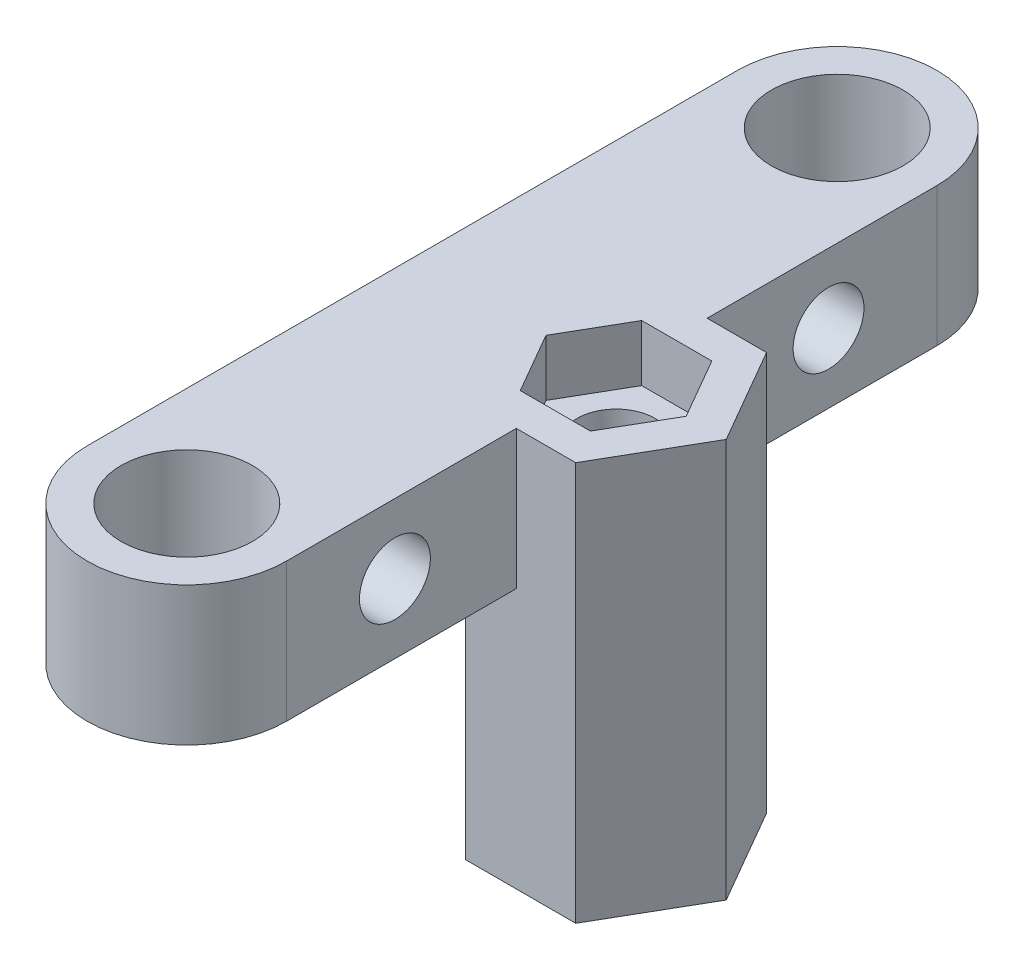
ISO-10303-21;
HEADER;
FILE_DESCRIPTION(('STEP AP214'),'2;1');
FILE_NAME('part.step','',(''),(''),'','','');
FILE_SCHEMA(('AUTOMOTIVE_DESIGN { 1 0 10303 214 1 1 1 1 }'));
ENDSEC;
DATA;
#1=APPLICATION_CONTEXT('core data for automotive mechanical design processes');
#2=APPLICATION_PROTOCOL_DEFINITION('international standard','automotive_design',2000,#1);
#3=PRODUCT_CONTEXT('',#1,'mechanical');
#4=PRODUCT('Part','Part','',(#3));
#5=PRODUCT_RELATED_PRODUCT_CATEGORY('part','',(#4));
#6=PRODUCT_DEFINITION_FORMATION('','',#4);
#7=PRODUCT_DEFINITION_CONTEXT('part definition',#1,'design');
#8=PRODUCT_DEFINITION('design','',#6,#7);
#9=PRODUCT_DEFINITION_SHAPE('','',#8);
#10=(LENGTH_UNIT() NAMED_UNIT(*) SI_UNIT(.MILLI.,.METRE.));
#11=(NAMED_UNIT(*) PLANE_ANGLE_UNIT() SI_UNIT($,.RADIAN.));
#12=(NAMED_UNIT(*) SI_UNIT($,.STERADIAN.) SOLID_ANGLE_UNIT());
#13=UNCERTAINTY_MEASURE_WITH_UNIT(LENGTH_MEASURE(1.E-05),#10,'distance_accuracy_value','');
#14=(GEOMETRIC_REPRESENTATION_CONTEXT(3) GLOBAL_UNCERTAINTY_ASSIGNED_CONTEXT((#13)) GLOBAL_UNIT_ASSIGNED_CONTEXT((#10,
#11,#12)) REPRESENTATION_CONTEXT('',''));
#15=CARTESIAN_POINT('',(0.,0.,0.));
#16=DIRECTION('',(0.,0.,1.));
#17=DIRECTION('',(1.,0.,0.));
#18=AXIS2_PLACEMENT_3D('',#15,#16,#17);
#19=CARTESIAN_POINT('',(0.,0.,0.));
#20=DIRECTION('',(0.,1.,0.));
#21=DIRECTION('',(0.,0.,1.));
#22=AXIS2_PLACEMENT_3D('',#19,#20,#21);
#23=PLANE('',#22);
#24=CARTESIAN_POINT('',(-12.,0.,-37.5));
#25=DIRECTION('',(0.,1.,0.));
#26=DIRECTION('',(0.,0.,1.));
#27=AXIS2_PLACEMENT_3D('',#24,#25,#26);
#28=CIRCLE('',#27,7.5875);
#29=CARTESIAN_POINT('',(-12.,0.,-29.9125));
#30=VERTEX_POINT('',#29);
#31=EDGE_CURVE('E354',#30,#30,#28,.T.);
#32=ORIENTED_EDGE('',*,*,#31,.T.);
#33=EDGE_LOOP('',(#32));
#34=FACE_BOUND('',#33,.T.);
#35=CARTESIAN_POINT('',(-12.,0.,37.5));
#36=DIRECTION('',(0.,1.,0.));
#37=DIRECTION('',(0.,0.,1.));
#38=AXIS2_PLACEMENT_3D('',#35,#36,#37);
#39=CIRCLE('',#38,7.5875);
#40=CARTESIAN_POINT('',(-12.,0.,45.0875));
#41=VERTEX_POINT('',#40);
#42=EDGE_CURVE('E311',#41,#41,#39,.F.);
#43=ORIENTED_EDGE('',*,*,#42,.F.);
#44=EDGE_LOOP('',(#43));
#45=FACE_BOUND('',#44,.T.);
#46=DIRECTION('',(1.,0.,0.));
#47=VECTOR('',#46,1.);
#48=CARTESIAN_POINT('',(-6.35085296108588,0.,-11.));
#49=LINE('',#48,#47);
#50=CARTESIAN_POINT('',(-6.35085296108588,0.,-11.));
#51=VERTEX_POINT('',#50);
#52=CARTESIAN_POINT('',(-0.500000000000007,0.,-11.));
#53=VERTEX_POINT('',#52);
#54=EDGE_CURVE('E51',#51,#53,#49,.T.);
#55=ORIENTED_EDGE('',*,*,#54,.F.);
#56=DIRECTION('',(0.5,0.,-0.866025403784439));
#57=VECTOR('',#56,1.);
#58=CARTESIAN_POINT('',(-12.7017059221718,0.,0.));
#59=LINE('',#58,#57);
#60=CARTESIAN_POINT('',(-12.7017059221718,0.,0.));
#61=VERTEX_POINT('',#60);
#62=EDGE_CURVE('E55',#61,#51,#59,.T.);
#63=ORIENTED_EDGE('',*,*,#62,.F.);
#64=DIRECTION('',(-0.5,0.,-0.866025403784439));
#65=VECTOR('',#64,1.);
#66=CARTESIAN_POINT('',(-6.35085296108588,0.,11.));
#67=LINE('',#66,#65);
#68=CARTESIAN_POINT('',(-6.35085296108588,0.,11.));
#69=VERTEX_POINT('',#68);
#70=EDGE_CURVE('E215',#69,#61,#67,.T.);
#71=ORIENTED_EDGE('',*,*,#70,.F.);
#72=DIRECTION('',(-1.,0.,0.));
#73=VECTOR('',#72,1.);
#74=CARTESIAN_POINT('',(6.35085296108587,0.,11.));
#75=LINE('',#74,#73);
#76=CARTESIAN_POINT('',(-0.500000000000007,0.,11.));
#77=VERTEX_POINT('',#76);
#78=EDGE_CURVE('E11',#77,#69,#75,.T.);
#79=ORIENTED_EDGE('',*,*,#78,.F.);
#80=DIRECTION('',(0.,0.,-1.));
#81=VECTOR('',#80,1.);
#82=CARTESIAN_POINT('',(-0.500000000000006,0.,0.));
#83=LINE('',#82,#81);
#84=CARTESIAN_POINT('',(-0.500000000000011,0.,37.5));
#85=VERTEX_POINT('',#84);
#86=EDGE_CURVE('E299',#85,#77,#83,.T.);
#87=ORIENTED_EDGE('',*,*,#86,.F.);
#88=CARTESIAN_POINT('',(-12.,0.,37.5));
#89=DIRECTION('',(0.,1.,0.));
#90=DIRECTION('',(0.,0.,1.));
#91=AXIS2_PLACEMENT_3D('',#88,#89,#90);
#92=CIRCLE('',#91,11.5);
#93=CARTESIAN_POINT('',(-23.5,0.,37.5));
#94=VERTEX_POINT('',#93);
#95=EDGE_CURVE('E303',#94,#85,#92,.T.);
#96=ORIENTED_EDGE('',*,*,#95,.F.);
#97=DIRECTION('',(0.,0.,-1.));
#98=VECTOR('',#97,1.);
#99=CARTESIAN_POINT('',(-23.5,0.,0.));
#100=LINE('',#99,#98);
#101=CARTESIAN_POINT('',(-23.5,0.,-37.5));
#102=VERTEX_POINT('',#101);
#103=EDGE_CURVE('E414',#94,#102,#100,.T.);
#104=ORIENTED_EDGE('',*,*,#103,.T.);
#105=CARTESIAN_POINT('',(-12.,0.,-37.5));
#106=DIRECTION('',(0.,1.,0.));
#107=DIRECTION('',(0.,0.,1.));
#108=AXIS2_PLACEMENT_3D('',#105,#106,#107);
#109=CIRCLE('',#108,11.5);
#110=CARTESIAN_POINT('',(-0.500000000000011,0.,-37.5));
#111=VERTEX_POINT('',#110);
#112=EDGE_CURVE('E359',#102,#111,#109,.F.);
#113=ORIENTED_EDGE('',*,*,#112,.T.);
#114=DIRECTION('',(0.,0.,1.));
#115=VECTOR('',#114,1.);
#116=CARTESIAN_POINT('',(-0.500000000000006,0.,0.));
#117=LINE('',#116,#115);
#118=EDGE_CURVE('E302',#111,#53,#117,.T.);
#119=ORIENTED_EDGE('',*,*,#118,.T.);
#120=EDGE_LOOP('',(#55,#63,#71,#79,#87,#96,#104,#113,#119));
#121=FACE_BOUND('',#120,.T.);
#122=ADVANCED_FACE('F34',(#34,#45,#121),#23,.F.);
#123=CARTESIAN_POINT('',(6.06217782649107,16.,3.5));
#124=DIRECTION('',(-0.866025403784439,0.,-0.5));
#125=DIRECTION('',(-0.5,0.,0.866025403784439));
#126=AXIS2_PLACEMENT_3D('',#123,#124,#125);
#127=PLANE('',#126);
#128=DIRECTION('',(0.5,0.,-0.866025403784439));
#129=VECTOR('',#128,1.);
#130=CARTESIAN_POINT('',(6.06217782649107,9.5,3.5));
#131=LINE('',#130,#129);
#132=CARTESIAN_POINT('',(4.04145188432738,9.5,7.));
#133=VERTEX_POINT('',#132);
#134=CARTESIAN_POINT('',(8.08290376865475,9.5,0.));
#135=VERTEX_POINT('',#134);
#136=EDGE_CURVE('E519',#133,#135,#131,.T.);
#137=ORIENTED_EDGE('',*,*,#136,.F.);
#138=DIRECTION('',(0.,-1.,0.));
#139=VECTOR('',#138,1.);
#140=CARTESIAN_POINT('',(4.04145188432738,16.,7.));
#141=LINE('',#140,#139);
#142=CARTESIAN_POINT('',(4.04145188432738,16.,7.));
#143=VERTEX_POINT('',#142);
#144=EDGE_CURVE('E43',#143,#133,#141,.T.);
#145=ORIENTED_EDGE('',*,*,#144,.F.);
#146=DIRECTION('',(0.5,0.,-0.866025403784439));
#147=VECTOR('',#146,1.);
#148=CARTESIAN_POINT('',(6.06217782649107,16.,3.5));
#149=LINE('',#148,#147);
#150=CARTESIAN_POINT('',(8.08290376865475,16.,0.));
#151=VERTEX_POINT('',#150);
#152=EDGE_CURVE('E394',#143,#151,#149,.T.);
#153=ORIENTED_EDGE('',*,*,#152,.T.);
#154=DIRECTION('',(0.,-1.,0.));
#155=VECTOR('',#154,1.);
#156=CARTESIAN_POINT('',(8.08290376865475,16.,0.));
#157=LINE('',#156,#155);
#158=EDGE_CURVE('E325',#151,#135,#157,.T.);
#159=ORIENTED_EDGE('',*,*,#158,.T.);
#160=EDGE_LOOP('',(#137,#145,#153,#159));
#161=FACE_BOUND('',#160,.T.);
#162=ADVANCED_FACE('F475',(#161),#127,.T.);
#163=CARTESIAN_POINT('',(0.,16.,7.));
#164=DIRECTION('',(0.,0.,-1.));
#165=DIRECTION('',(-1.,0.,0.));
#166=AXIS2_PLACEMENT_3D('',#163,#164,#165);
#167=PLANE('',#166);
#168=DIRECTION('',(1.,0.,0.));
#169=VECTOR('',#168,1.);
#170=CARTESIAN_POINT('',(0.,9.5,7.));
#171=LINE('',#170,#169);
#172=CARTESIAN_POINT('',(-4.04145188432738,9.5,7.));
#173=VERTEX_POINT('',#172);
#174=EDGE_CURVE('E505',#173,#133,#171,.T.);
#175=ORIENTED_EDGE('',*,*,#174,.F.);
#176=DIRECTION('',(0.,-1.,0.));
#177=VECTOR('',#176,1.);
#178=CARTESIAN_POINT('',(-4.04145188432738,16.,7.));
#179=LINE('',#178,#177);
#180=CARTESIAN_POINT('',(-4.04145188432738,16.,7.));
#181=VERTEX_POINT('',#180);
#182=EDGE_CURVE('E337',#181,#173,#179,.T.);
#183=ORIENTED_EDGE('',*,*,#182,.F.);
#184=DIRECTION('',(1.,0.,0.));
#185=VECTOR('',#184,1.);
#186=CARTESIAN_POINT('',(0.,16.,7.));
#187=LINE('',#186,#185);
#188=EDGE_CURVE('E397',#181,#143,#187,.T.);
#189=ORIENTED_EDGE('',*,*,#188,.T.);
#190=ORIENTED_EDGE('',*,*,#144,.T.);
#191=EDGE_LOOP('',(#175,#183,#189,#190));
#192=FACE_BOUND('',#191,.T.);
#193=ADVANCED_FACE('F482',(#192),#167,.T.);
#194=CARTESIAN_POINT('',(-6.06217782649107,16.,3.5));
#195=DIRECTION('',(0.866025403784439,0.,-0.5));
#196=DIRECTION('',(-0.5,0.,-0.866025403784439));
#197=AXIS2_PLACEMENT_3D('',#194,#195,#196);
#198=PLANE('',#197);
#199=DIRECTION('',(0.5,0.,0.866025403784439));
#200=VECTOR('',#199,1.);
#201=CARTESIAN_POINT('',(-6.06217782649107,9.5,3.5));
#202=LINE('',#201,#200);
#203=CARTESIAN_POINT('',(-8.08290376865476,9.5,0.));
#204=VERTEX_POINT('',#203);
#205=EDGE_CURVE('E507',#204,#173,#202,.T.);
#206=ORIENTED_EDGE('',*,*,#205,.F.);
#207=DIRECTION('',(0.,-1.,0.));
#208=VECTOR('',#207,1.);
#209=CARTESIAN_POINT('',(-8.08290376865476,16.,0.));
#210=LINE('',#209,#208);
#211=CARTESIAN_POINT('',(-8.08290376865476,16.,0.));
#212=VERTEX_POINT('',#211);
#213=EDGE_CURVE('E334',#212,#204,#210,.T.);
#214=ORIENTED_EDGE('',*,*,#213,.F.);
#215=DIRECTION('',(0.5,0.,0.866025403784439));
#216=VECTOR('',#215,1.);
#217=CARTESIAN_POINT('',(-6.06217782649107,16.,3.5));
#218=LINE('',#217,#216);
#219=EDGE_CURVE('E400',#212,#181,#218,.T.);
#220=ORIENTED_EDGE('',*,*,#219,.T.);
#221=ORIENTED_EDGE('',*,*,#182,.T.);
#222=EDGE_LOOP('',(#206,#214,#220,#221));
#223=FACE_BOUND('',#222,.T.);
#224=ADVANCED_FACE('F527',(#223),#198,.T.);
#225=CARTESIAN_POINT('',(-6.06217782649107,16.,-3.5));
#226=DIRECTION('',(0.866025403784439,0.,0.5));
#227=DIRECTION('',(0.5,0.,-0.866025403784439));
#228=AXIS2_PLACEMENT_3D('',#225,#226,#227);
#229=PLANE('',#228);
#230=DIRECTION('',(-0.5,0.,0.866025403784439));
#231=VECTOR('',#230,1.);
#232=CARTESIAN_POINT('',(-6.06217782649107,9.5,-3.5));
#233=LINE('',#232,#231);
#234=CARTESIAN_POINT('',(-4.04145188432738,9.5,-7.));
#235=VERTEX_POINT('',#234);
#236=EDGE_CURVE('E510',#235,#204,#233,.T.);
#237=ORIENTED_EDGE('',*,*,#236,.F.);
#238=DIRECTION('',(0.,-1.,0.));
#239=VECTOR('',#238,1.);
#240=CARTESIAN_POINT('',(-4.04145188432738,16.,-7.));
#241=LINE('',#240,#239);
#242=CARTESIAN_POINT('',(-4.04145188432738,16.,-7.));
#243=VERTEX_POINT('',#242);
#244=EDGE_CURVE('E331',#243,#235,#241,.T.);
#245=ORIENTED_EDGE('',*,*,#244,.F.);
#246=DIRECTION('',(-0.5,0.,0.866025403784439));
#247=VECTOR('',#246,1.);
#248=CARTESIAN_POINT('',(-6.06217782649107,16.,-3.5));
#249=LINE('',#248,#247);
#250=EDGE_CURVE('E403',#243,#212,#249,.T.);
#251=ORIENTED_EDGE('',*,*,#250,.T.);
#252=ORIENTED_EDGE('',*,*,#213,.T.);
#253=EDGE_LOOP('',(#237,#245,#251,#252));
#254=FACE_BOUND('',#253,.T.);
#255=ADVANCED_FACE('F534',(#254),#229,.T.);
#256=CARTESIAN_POINT('',(0.,16.,-7.));
#257=DIRECTION('',(0.,0.,1.));
#258=DIRECTION('',(1.,0.,0.));
#259=AXIS2_PLACEMENT_3D('',#256,#257,#258);
#260=PLANE('',#259);
#261=DIRECTION('',(-1.,0.,0.));
#262=VECTOR('',#261,1.);
#263=CARTESIAN_POINT('',(0.,9.5,-7.));
#264=LINE('',#263,#262);
#265=CARTESIAN_POINT('',(4.04145188432737,9.5,-7.));
#266=VERTEX_POINT('',#265);
#267=EDGE_CURVE('E513',#266,#235,#264,.T.);
#268=ORIENTED_EDGE('',*,*,#267,.F.);
#269=DIRECTION('',(0.,-1.,0.));
#270=VECTOR('',#269,1.);
#271=CARTESIAN_POINT('',(4.04145188432737,16.,-7.));
#272=LINE('',#271,#270);
#273=CARTESIAN_POINT('',(4.04145188432737,16.,-7.));
#274=VERTEX_POINT('',#273);
#275=EDGE_CURVE('E328',#274,#266,#272,.T.);
#276=ORIENTED_EDGE('',*,*,#275,.F.);
#277=DIRECTION('',(-1.,0.,0.));
#278=VECTOR('',#277,1.);
#279=CARTESIAN_POINT('',(0.,16.,-7.));
#280=LINE('',#279,#278);
#281=EDGE_CURVE('E406',#274,#243,#280,.T.);
#282=ORIENTED_EDGE('',*,*,#281,.T.);
#283=ORIENTED_EDGE('',*,*,#244,.T.);
#284=EDGE_LOOP('',(#268,#276,#282,#283));
#285=FACE_BOUND('',#284,.T.);
#286=ADVANCED_FACE('F537',(#285),#260,.T.);
#287=CARTESIAN_POINT('',(-12.,16.,-37.5));
#288=DIRECTION('',(0.,-1.,0.));
#289=DIRECTION('',(0.,0.,-1.));
#290=AXIS2_PLACEMENT_3D('',#287,#288,#289);
#291=CYLINDRICAL_SURFACE('',#290,11.5);
#292=ORIENTED_EDGE('',*,*,#112,.F.);
#293=DIRECTION('',(0.,-1.,0.));
#294=VECTOR('',#293,1.);
#295=CARTESIAN_POINT('',(-23.5,16.,-37.5));
#296=LINE('',#295,#294);
#297=CARTESIAN_POINT('',(-23.5,16.,-37.5));
#298=VERTEX_POINT('',#297);
#299=EDGE_CURVE('E329',#298,#102,#296,.T.);
#300=ORIENTED_EDGE('',*,*,#299,.F.);
#301=CARTESIAN_POINT('',(-12.,16.,-37.5));
#302=DIRECTION('',(0.,1.,0.));
#303=DIRECTION('',(0.,0.,1.));
#304=AXIS2_PLACEMENT_3D('',#301,#302,#303);
#305=CIRCLE('',#304,11.5);
#306=CARTESIAN_POINT('',(-0.500000000000011,16.,-37.5));
#307=VERTEX_POINT('',#306);
#308=EDGE_CURVE('E320',#298,#307,#305,.F.);
#309=ORIENTED_EDGE('',*,*,#308,.T.);
#310=DIRECTION('',(0.,-1.,0.));
#311=VECTOR('',#310,1.);
#312=CARTESIAN_POINT('',(-0.500000000000011,16.,-37.5));
#313=LINE('',#312,#311);
#314=EDGE_CURVE('E309',#307,#111,#313,.T.);
#315=ORIENTED_EDGE('',*,*,#314,.T.);
#316=EDGE_LOOP('',(#292,#300,#309,#315));
#317=FACE_BOUND('',#316,.T.);
#318=ADVANCED_FACE('F429',(#317),#291,.T.);
#319=CARTESIAN_POINT('',(-23.5,16.,0.));
#320=DIRECTION('',(-1.,0.,0.));
#321=DIRECTION('',(0.,0.,1.));
#322=AXIS2_PLACEMENT_3D('',#319,#320,#321);
#323=PLANE('',#322);
#324=CARTESIAN_POINT('',(-23.5,8.,25.));
#325=DIRECTION('',(-1.,0.,0.));
#326=DIRECTION('',(0.,0.,-1.));
#327=AXIS2_PLACEMENT_3D('',#324,#325,#326);
#328=CIRCLE('',#327,4.0875);
#329=CARTESIAN_POINT('',(-23.5,8.,20.9125));
#330=VERTEX_POINT('',#329);
#331=EDGE_CURVE('E366',#330,#330,#328,.T.);
#332=ORIENTED_EDGE('',*,*,#331,.F.);
#333=EDGE_LOOP('',(#332));
#334=FACE_BOUND('',#333,.T.);
#335=CARTESIAN_POINT('',(-23.5,8.,-25.));
#336=DIRECTION('',(-1.,0.,0.));
#337=DIRECTION('',(0.,0.,1.));
#338=AXIS2_PLACEMENT_3D('',#335,#336,#337);
#339=CIRCLE('',#338,4.0875);
#340=CARTESIAN_POINT('',(-23.5,8.,-20.9125));
#341=VERTEX_POINT('',#340);
#342=EDGE_CURVE('E355',#341,#341,#339,.T.);
#343=ORIENTED_EDGE('',*,*,#342,.F.);
#344=EDGE_LOOP('',(#343));
#345=FACE_BOUND('',#344,.T.);
#346=ORIENTED_EDGE('',*,*,#103,.F.);
#347=DIRECTION('',(0.,-1.,0.));
#348=VECTOR('',#347,1.);
#349=CARTESIAN_POINT('',(-23.5,16.,37.5));
#350=LINE('',#349,#348);
#351=CARTESIAN_POINT('',(-23.5,16.,37.5));
#352=VERTEX_POINT('',#351);
#353=EDGE_CURVE('E350',#352,#94,#350,.T.);
#354=ORIENTED_EDGE('',*,*,#353,.F.);
#355=DIRECTION('',(0.,0.,-1.));
#356=VECTOR('',#355,1.);
#357=CARTESIAN_POINT('',(-23.5,16.,0.));
#358=LINE('',#357,#356);
#359=EDGE_CURVE('E372',#352,#298,#358,.T.);
#360=ORIENTED_EDGE('',*,*,#359,.T.);
#361=ORIENTED_EDGE('',*,*,#299,.T.);
#362=EDGE_LOOP('',(#346,#354,#360,#361));
#363=FACE_BOUND('',#362,.T.);
#364=ADVANCED_FACE('F424',(#334,#345,#363),#323,.T.);
#365=CARTESIAN_POINT('',(-12.,16.,37.5));
#366=DIRECTION('',(0.,-1.,0.));
#367=DIRECTION('',(0.,0.,-1.));
#368=AXIS2_PLACEMENT_3D('',#365,#366,#367);
#369=CYLINDRICAL_SURFACE('',#368,11.5);
#370=ORIENTED_EDGE('',*,*,#95,.T.);
#371=DIRECTION('',(0.,-1.,0.));
#372=VECTOR('',#371,1.);
#373=CARTESIAN_POINT('',(-0.500000000000011,16.,37.5));
#374=LINE('',#373,#372);
#375=CARTESIAN_POINT('',(-0.500000000000011,16.,37.5));
#376=VERTEX_POINT('',#375);
#377=EDGE_CURVE('E295',#376,#85,#374,.T.);
#378=ORIENTED_EDGE('',*,*,#377,.F.);
#379=CARTESIAN_POINT('',(-12.,16.,37.5));
#380=DIRECTION('',(0.,1.,0.));
#381=DIRECTION('',(0.,0.,1.));
#382=AXIS2_PLACEMENT_3D('',#379,#380,#381);
#383=CIRCLE('',#382,11.5);
#384=EDGE_CURVE('E375',#352,#376,#383,.T.);
#385=ORIENTED_EDGE('',*,*,#384,.F.);
#386=ORIENTED_EDGE('',*,*,#353,.T.);
#387=EDGE_LOOP('',(#370,#378,#385,#386));
#388=FACE_BOUND('',#387,.T.);
#389=ADVANCED_FACE('F421',(#388),#369,.T.);
#390=CARTESIAN_POINT('',(-0.500000000000006,16.,0.));
#391=DIRECTION('',(-1.,0.,0.));
#392=DIRECTION('',(0.,0.,1.));
#393=AXIS2_PLACEMENT_3D('',#390,#391,#392);
#394=PLANE('',#393);
#395=CARTESIAN_POINT('',(-0.500000000000009,8.,25.));
#396=DIRECTION('',(-1.,0.,0.));
#397=DIRECTION('',(0.,0.,1.));
#398=AXIS2_PLACEMENT_3D('',#395,#396,#397);
#399=CIRCLE('',#398,4.0875);
#400=CARTESIAN_POINT('',(-0.50000000000001,8.,29.0875));
#401=VERTEX_POINT('',#400);
#402=EDGE_CURVE('E288',#401,#401,#399,.T.);
#403=ORIENTED_EDGE('',*,*,#402,.T.);
#404=EDGE_LOOP('',(#403));
#405=FACE_BOUND('',#404,.T.);
#406=ORIENTED_EDGE('',*,*,#86,.T.);
#407=DIRECTION('',(0.,-1.,0.));
#408=VECTOR('',#407,1.);
#409=CARTESIAN_POINT('',(-0.500000000000007,16.,11.));
#410=LINE('',#409,#408);
#411=CARTESIAN_POINT('',(-0.500000000000007,16.,11.));
#412=VERTEX_POINT('',#411);
#413=EDGE_CURVE('E292',#412,#77,#410,.T.);
#414=ORIENTED_EDGE('',*,*,#413,.F.);
#415=DIRECTION('',(0.,0.,-1.));
#416=VECTOR('',#415,1.);
#417=CARTESIAN_POINT('',(-0.500000000000006,16.,0.));
#418=LINE('',#417,#416);
#419=EDGE_CURVE('E378',#376,#412,#418,.T.);
#420=ORIENTED_EDGE('',*,*,#419,.F.);
#421=ORIENTED_EDGE('',*,*,#377,.T.);
#422=EDGE_LOOP('',(#406,#414,#420,#421));
#423=FACE_BOUND('',#422,.T.);
#424=ADVANCED_FACE('F452',(#405,#423),#394,.F.);
#425=CARTESIAN_POINT('',(0.,16.,11.));
#426=DIRECTION('',(0.,0.,1.));
#427=DIRECTION('',(1.,0.,0.));
#428=AXIS2_PLACEMENT_3D('',#425,#426,#427);
#429=PLANE('',#428);
#430=ORIENTED_EDGE('',*,*,#413,.T.);
#431=ORIENTED_EDGE('',*,*,#78,.T.);
#432=DIRECTION('',(0.,1.,0.));
#433=VECTOR('',#432,1.);
#434=CARTESIAN_POINT('',(-6.35085296108588,-30.,11.));
#435=LINE('',#434,#433);
#436=CARTESIAN_POINT('',(-6.35085296108588,-30.,11.));
#437=VERTEX_POINT('',#436);
#438=EDGE_CURVE('E277',#437,#69,#435,.T.);
#439=ORIENTED_EDGE('',*,*,#438,.F.);
#440=DIRECTION('',(-1.,0.,0.));
#441=VECTOR('',#440,1.);
#442=CARTESIAN_POINT('',(6.35085296108587,-30.,11.));
#443=LINE('',#442,#441);
#444=CARTESIAN_POINT('',(6.35085296108587,-30.,11.));
#445=VERTEX_POINT('',#444);
#446=EDGE_CURVE('E260',#445,#437,#443,.T.);
#447=ORIENTED_EDGE('',*,*,#446,.F.);
#448=DIRECTION('',(0.,-1.,0.));
#449=VECTOR('',#448,1.);
#450=CARTESIAN_POINT('',(6.35085296108584,16.,11.));
#451=LINE('',#450,#449);
#452=CARTESIAN_POINT('',(6.35085296108584,16.,11.));
#453=VERTEX_POINT('',#452);
#454=EDGE_CURVE('E296',#453,#445,#451,.T.);
#455=ORIENTED_EDGE('',*,*,#454,.F.);
#456=DIRECTION('',(-1.,0.,0.));
#457=VECTOR('',#456,1.);
#458=CARTESIAN_POINT('',(0.,16.,11.));
#459=LINE('',#458,#457);
#460=EDGE_CURVE('E380',#453,#412,#459,.T.);
#461=ORIENTED_EDGE('',*,*,#460,.T.);
#462=EDGE_LOOP('',(#430,#431,#439,#447,#455,#461));
#463=FACE_BOUND('',#462,.T.);
#464=ADVANCED_FACE('F447',(#463),#429,.T.);
#465=CARTESIAN_POINT('',(9.52627944162881,16.,5.49999999999999));
#466=DIRECTION('',(0.866025403784439,0.,0.5));
#467=DIRECTION('',(0.5,0.,-0.866025403784439));
#468=AXIS2_PLACEMENT_3D('',#465,#466,#467);
#469=PLANE('',#468);
#470=ORIENTED_EDGE('',*,*,#454,.T.);
#471=DIRECTION('',(-0.5,0.,0.866025403784439));
#472=VECTOR('',#471,1.);
#473=CARTESIAN_POINT('',(12.7017059221717,-30.,0.));
#474=LINE('',#473,#472);
#475=CARTESIAN_POINT('',(12.7017059221717,-30.,0.));
#476=VERTEX_POINT('',#475);
#477=EDGE_CURVE('E257',#476,#445,#474,.T.);
#478=ORIENTED_EDGE('',*,*,#477,.F.);
#479=DIRECTION('',(0.,-1.,0.));
#480=VECTOR('',#479,1.);
#481=CARTESIAN_POINT('',(12.7017059221717,16.,0.));
#482=LINE('',#481,#480);
#483=CARTESIAN_POINT('',(12.7017059221717,16.,0.));
#484=VERTEX_POINT('',#483);
#485=EDGE_CURVE('E345',#484,#476,#482,.T.);
#486=ORIENTED_EDGE('',*,*,#485,.F.);
#487=DIRECTION('',(-0.5,0.,0.866025403784439));
#488=VECTOR('',#487,1.);
#489=CARTESIAN_POINT('',(9.52627944162881,16.,5.49999999999999));
#490=LINE('',#489,#488);
#491=EDGE_CURVE('E383',#484,#453,#490,.T.);
#492=ORIENTED_EDGE('',*,*,#491,.T.);
#493=EDGE_LOOP('',(#470,#478,#486,#492));
#494=FACE_BOUND('',#493,.T.);
#495=ADVANCED_FACE('F465',(#494),#469,.T.);
#496=CARTESIAN_POINT('',(9.52627944162881,16.,-5.49999999999999));
#497=DIRECTION('',(-0.866025403784439,0.,0.5));
#498=DIRECTION('',(0.5,0.,0.866025403784439));
#499=AXIS2_PLACEMENT_3D('',#496,#497,#498);
#500=PLANE('',#499);
#501=ORIENTED_EDGE('',*,*,#485,.T.);
#502=DIRECTION('',(0.5,0.,0.866025403784439));
#503=VECTOR('',#502,1.);
#504=CARTESIAN_POINT('',(6.35085296108588,-30.,-11.));
#505=LINE('',#504,#503);
#506=CARTESIAN_POINT('',(6.35085296108588,-30.,-11.));
#507=VERTEX_POINT('',#506);
#508=EDGE_CURVE('E254',#507,#476,#505,.T.);
#509=ORIENTED_EDGE('',*,*,#508,.F.);
#510=DIRECTION('',(0.,-1.,0.));
#511=VECTOR('',#510,1.);
#512=CARTESIAN_POINT('',(6.35085296108584,16.,-11.));
#513=LINE('',#512,#511);
#514=CARTESIAN_POINT('',(6.35085296108584,16.,-11.));
#515=VERTEX_POINT('',#514);
#516=EDGE_CURVE('E308',#515,#507,#513,.T.);
#517=ORIENTED_EDGE('',*,*,#516,.F.);
#518=DIRECTION('',(-0.5,0.,-0.866025403784439));
#519=VECTOR('',#518,1.);
#520=CARTESIAN_POINT('',(9.52627944162881,16.,-5.49999999999999));
#521=LINE('',#520,#519);
#522=EDGE_CURVE('E386',#484,#515,#521,.T.);
#523=ORIENTED_EDGE('',*,*,#522,.F.);
#524=EDGE_LOOP('',(#501,#509,#517,#523));
#525=FACE_BOUND('',#524,.T.);
#526=ADVANCED_FACE('F461',(#525),#500,.F.);
#527=CARTESIAN_POINT('',(0.,16.,-11.));
#528=DIRECTION('',(0.,0.,1.));
#529=DIRECTION('',(1.,0.,0.));
#530=AXIS2_PLACEMENT_3D('',#527,#528,#529);
#531=PLANE('',#530);
#532=ORIENTED_EDGE('',*,*,#516,.T.);
#533=DIRECTION('',(1.,0.,0.));
#534=VECTOR('',#533,1.);
#535=CARTESIAN_POINT('',(-6.35085296108588,-30.,-11.));
#536=LINE('',#535,#534);
#537=CARTESIAN_POINT('',(-6.35085296108588,-30.,-11.));
#538=VERTEX_POINT('',#537);
#539=EDGE_CURVE('E266',#538,#507,#536,.T.);
#540=ORIENTED_EDGE('',*,*,#539,.F.);
#541=DIRECTION('',(0.,1.,0.));
#542=VECTOR('',#541,1.);
#543=CARTESIAN_POINT('',(-6.35085296108588,-30.,-11.));
#544=LINE('',#543,#542);
#545=EDGE_CURVE('E269',#538,#51,#544,.T.);
#546=ORIENTED_EDGE('',*,*,#545,.T.);
#547=ORIENTED_EDGE('',*,*,#54,.T.);
#548=DIRECTION('',(0.,-1.,0.));
#549=VECTOR('',#548,1.);
#550=CARTESIAN_POINT('',(-0.500000000000007,16.,-11.));
#551=LINE('',#550,#549);
#552=CARTESIAN_POINT('',(-0.500000000000007,16.,-11.));
#553=VERTEX_POINT('',#552);
#554=EDGE_CURVE('E306',#553,#53,#551,.T.);
#555=ORIENTED_EDGE('',*,*,#554,.F.);
#556=DIRECTION('',(-1.,0.,0.));
#557=VECTOR('',#556,1.);
#558=CARTESIAN_POINT('',(0.,16.,-11.));
#559=LINE('',#558,#557);
#560=EDGE_CURVE('E389',#515,#553,#559,.T.);
#561=ORIENTED_EDGE('',*,*,#560,.F.);
#562=EDGE_LOOP('',(#532,#540,#546,#547,#555,#561));
#563=FACE_BOUND('',#562,.T.);
#564=ADVANCED_FACE('F435',(#563),#531,.F.);
#565=CARTESIAN_POINT('',(6.06217782649106,16.,-3.5));
#566=DIRECTION('',(-0.866025403784439,0.,0.5));
#567=DIRECTION('',(0.5,0.,0.866025403784439));
#568=AXIS2_PLACEMENT_3D('',#565,#566,#567);
#569=PLANE('',#568);
#570=DIRECTION('',(-0.5,0.,-0.866025403784439));
#571=VECTOR('',#570,1.);
#572=CARTESIAN_POINT('',(6.06217782649106,9.5,-3.5));
#573=LINE('',#572,#571);
#574=EDGE_CURVE('E516',#135,#266,#573,.T.);
#575=ORIENTED_EDGE('',*,*,#574,.F.);
#576=ORIENTED_EDGE('',*,*,#158,.F.);
#577=DIRECTION('',(-0.5,0.,-0.866025403784439));
#578=VECTOR('',#577,1.);
#579=CARTESIAN_POINT('',(6.06217782649106,16.,-3.5));
#580=LINE('',#579,#578);
#581=EDGE_CURVE('E409',#151,#274,#580,.T.);
#582=ORIENTED_EDGE('',*,*,#581,.T.);
#583=ORIENTED_EDGE('',*,*,#275,.T.);
#584=EDGE_LOOP('',(#575,#576,#582,#583));
#585=FACE_BOUND('',#584,.T.);
#586=ADVANCED_FACE('F539',(#585),#569,.T.);
#587=CARTESIAN_POINT('',(-0.500000000000006,16.,0.));
#588=DIRECTION('',(1.,0.,0.));
#589=DIRECTION('',(0.,0.,-1.));
#590=AXIS2_PLACEMENT_3D('',#587,#588,#589);
#591=PLANE('',#590);
#592=CARTESIAN_POINT('',(-0.500000000000009,8.,-25.));
#593=DIRECTION('',(1.,0.,0.));
#594=DIRECTION('',(0.,0.,-1.));
#595=AXIS2_PLACEMENT_3D('',#592,#593,#594);
#596=CIRCLE('',#595,4.0875);
#597=CARTESIAN_POINT('',(-0.50000000000001,8.,-29.0875));
#598=VERTEX_POINT('',#597);
#599=EDGE_CURVE('E352',#598,#598,#596,.T.);
#600=ORIENTED_EDGE('',*,*,#599,.F.);
#601=EDGE_LOOP('',(#600));
#602=FACE_BOUND('',#601,.T.);
#603=ORIENTED_EDGE('',*,*,#118,.F.);
#604=ORIENTED_EDGE('',*,*,#314,.F.);
#605=DIRECTION('',(0.,0.,1.));
#606=VECTOR('',#605,1.);
#607=CARTESIAN_POINT('',(-0.500000000000006,16.,0.));
#608=LINE('',#607,#606);
#609=EDGE_CURVE('E391',#307,#553,#608,.T.);
#610=ORIENTED_EDGE('',*,*,#609,.T.);
#611=ORIENTED_EDGE('',*,*,#554,.T.);
#612=EDGE_LOOP('',(#603,#604,#610,#611));
#613=FACE_BOUND('',#612,.T.);
#614=ADVANCED_FACE('F431',(#602,#613),#591,.T.);
#615=CARTESIAN_POINT('',(-12.,16.,-37.5));
#616=DIRECTION('',(0.,-1.,0.));
#617=DIRECTION('',(0.,0.,-1.));
#618=AXIS2_PLACEMENT_3D('',#615,#616,#617);
#619=CYLINDRICAL_SURFACE('',#618,7.5875);
#620=CARTESIAN_POINT('',(-12.,16.,-37.5));
#621=DIRECTION('',(0.,1.,0.));
#622=DIRECTION('',(0.,0.,1.));
#623=AXIS2_PLACEMENT_3D('',#620,#621,#622);
#624=CIRCLE('',#623,7.5875);
#625=CARTESIAN_POINT('',(-12.,16.,-29.9125));
#626=VERTEX_POINT('',#625);
#627=EDGE_CURVE('E315',#626,#626,#624,.T.);
#628=ORIENTED_EDGE('',*,*,#627,.T.);
#629=EDGE_LOOP('',(#628));
#630=FACE_BOUND('',#629,.T.);
#631=ORIENTED_EDGE('',*,*,#31,.F.);
#632=EDGE_LOOP('',(#631));
#633=FACE_BOUND('',#632,.T.);
#634=ADVANCED_FACE('F36',(#630,#633),#619,.F.);
#635=CARTESIAN_POINT('',(-12.,16.,37.5));
#636=DIRECTION('',(0.,-1.,0.));
#637=DIRECTION('',(0.,0.,-1.));
#638=AXIS2_PLACEMENT_3D('',#635,#636,#637);
#639=CYLINDRICAL_SURFACE('',#638,7.5875);
#640=CARTESIAN_POINT('',(-12.,16.,37.5));
#641=DIRECTION('',(0.,1.,0.));
#642=DIRECTION('',(0.,0.,1.));
#643=AXIS2_PLACEMENT_3D('',#640,#641,#642);
#644=CIRCLE('',#643,7.5875);
#645=CARTESIAN_POINT('',(-12.,16.,45.0875));
#646=VERTEX_POINT('',#645);
#647=EDGE_CURVE('E343',#646,#646,#644,.F.);
#648=ORIENTED_EDGE('',*,*,#647,.F.);
#649=EDGE_LOOP('',(#648));
#650=FACE_BOUND('',#649,.T.);
#651=ORIENTED_EDGE('',*,*,#42,.T.);
#652=EDGE_LOOP('',(#651));
#653=FACE_BOUND('',#652,.T.);
#654=ADVANCED_FACE('F497',(#650,#653),#639,.F.);
#655=CARTESIAN_POINT('',(0.,16.,0.));
#656=DIRECTION('',(0.,1.,0.));
#657=DIRECTION('',(0.,0.,1.));
#658=AXIS2_PLACEMENT_3D('',#655,#656,#657);
#659=PLANE('',#658);
#660=ORIENTED_EDGE('',*,*,#627,.F.);
#661=EDGE_LOOP('',(#660));
#662=FACE_BOUND('',#661,.T.);
#663=ORIENTED_EDGE('',*,*,#308,.F.);
#664=ORIENTED_EDGE('',*,*,#359,.F.);
#665=ORIENTED_EDGE('',*,*,#384,.T.);
#666=ORIENTED_EDGE('',*,*,#419,.T.);
#667=ORIENTED_EDGE('',*,*,#460,.F.);
#668=ORIENTED_EDGE('',*,*,#491,.F.);
#669=ORIENTED_EDGE('',*,*,#522,.T.);
#670=ORIENTED_EDGE('',*,*,#560,.T.);
#671=ORIENTED_EDGE('',*,*,#609,.F.);
#672=EDGE_LOOP('',(#663,#664,#665,#666,#667,#668,#669,#670,#671));
#673=FACE_BOUND('',#672,.T.);
#674=ORIENTED_EDGE('',*,*,#152,.F.);
#675=ORIENTED_EDGE('',*,*,#188,.F.);
#676=ORIENTED_EDGE('',*,*,#219,.F.);
#677=ORIENTED_EDGE('',*,*,#250,.F.);
#678=ORIENTED_EDGE('',*,*,#281,.F.);
#679=ORIENTED_EDGE('',*,*,#581,.F.);
#680=EDGE_LOOP('',(#674,#675,#676,#677,#678,#679));
#681=FACE_BOUND('',#680,.T.);
#682=ORIENTED_EDGE('',*,*,#647,.T.);
#683=EDGE_LOOP('',(#682));
#684=FACE_BOUND('',#683,.T.);
#685=ADVANCED_FACE('F454',(#662,#673,#681,#684),#659,.T.);
#686=DIRECTION('',(1.,0.,0.));
#687=VECTOR('',#686,1.);
#688=CARTESIAN_POINT('',(-4.04145188432738,0.,-7.));
#689=LINE('',#688,#687);
#690=CARTESIAN_POINT('',(-4.04145188432738,0.,-7.));
#691=VERTEX_POINT('',#690);
#692=CARTESIAN_POINT('',(4.04145188432738,0.,-7.00000000000001));
#693=VERTEX_POINT('',#692);
#694=EDGE_CURVE('E208',#691,#693,#689,.T.);
#695=ORIENTED_EDGE('',*,*,#694,.T.);
#696=DIRECTION('',(0.499999999999999,0.,0.866025403784439));
#697=VECTOR('',#696,1.);
#698=CARTESIAN_POINT('',(4.04145188432738,0.,-7.00000000000001));
#699=LINE('',#698,#697);
#700=CARTESIAN_POINT('',(8.08290376865476,0.,0.));
#701=VERTEX_POINT('',#700);
#702=EDGE_CURVE('E232',#693,#701,#699,.T.);
#703=ORIENTED_EDGE('',*,*,#702,.T.);
#704=DIRECTION('',(-0.5,0.,0.866025403784439));
#705=VECTOR('',#704,1.);
#706=CARTESIAN_POINT('',(8.08290376865476,0.,0.));
#707=LINE('',#706,#705);
#708=CARTESIAN_POINT('',(4.04145188432738,0.,7.00000000000001));
#709=VERTEX_POINT('',#708);
#710=EDGE_CURVE('E214',#701,#709,#707,.T.);
#711=ORIENTED_EDGE('',*,*,#710,.T.);
#712=DIRECTION('',(-1.,0.,0.));
#713=VECTOR('',#712,1.);
#714=CARTESIAN_POINT('',(4.04145188432738,0.,7.00000000000001));
#715=LINE('',#714,#713);
#716=CARTESIAN_POINT('',(-4.04145188432738,0.,7.00000000000001));
#717=VERTEX_POINT('',#716);
#718=EDGE_CURVE('E235',#709,#717,#715,.T.);
#719=ORIENTED_EDGE('',*,*,#718,.T.);
#720=DIRECTION('',(-0.5,0.,-0.866025403784439));
#721=VECTOR('',#720,1.);
#722=CARTESIAN_POINT('',(-4.04145188432738,0.,7.00000000000001));
#723=LINE('',#722,#721);
#724=CARTESIAN_POINT('',(-8.08290376865476,0.,0.));
#725=VERTEX_POINT('',#724);
#726=EDGE_CURVE('E238',#717,#725,#723,.T.);
#727=ORIENTED_EDGE('',*,*,#726,.T.);
#728=DIRECTION('',(0.5,0.,-0.866025403784439));
#729=VECTOR('',#728,1.);
#730=CARTESIAN_POINT('',(-8.08290376865476,0.,0.));
#731=LINE('',#730,#729);
#732=EDGE_CURVE('E241',#725,#691,#731,.T.);
#733=ORIENTED_EDGE('',*,*,#732,.T.);
#734=EDGE_LOOP('',(#695,#703,#711,#719,#727,#733));
#735=FACE_BOUND('',#734,.T.);
#736=CARTESIAN_POINT('',(0.,0.,0.));
#737=DIRECTION('',(0.,1.,0.));
#738=DIRECTION('',(0.,0.,1.));
#739=AXIS2_PLACEMENT_3D('',#736,#737,#738);
#740=CIRCLE('',#739,4.49999999999999);
#741=CARTESIAN_POINT('',(0.,0.,4.49999999999999));
#742=VERTEX_POINT('',#741);
#743=EDGE_CURVE('E280',#742,#742,#740,.T.);
#744=ORIENTED_EDGE('',*,*,#743,.T.);
#745=EDGE_LOOP('',(#744));
#746=FACE_BOUND('',#745,.T.);
#747=ADVANCED_FACE('F478',(#735,#746),#23,.F.);
#748=CARTESIAN_POINT('',(12.7017059221717,8.,-25.));
#749=DIRECTION('',(-1.,0.,0.));
#750=DIRECTION('',(0.,0.,1.));
#751=AXIS2_PLACEMENT_3D('',#748,#749,#750);
#752=CYLINDRICAL_SURFACE('',#751,4.0875);
#753=ORIENTED_EDGE('',*,*,#599,.T.);
#754=EDGE_LOOP('',(#753));
#755=FACE_BOUND('',#754,.T.);
#756=ORIENTED_EDGE('',*,*,#342,.T.);
#757=EDGE_LOOP('',(#756));
#758=FACE_BOUND('',#757,.T.);
#759=ADVANCED_FACE('F489',(#755,#758),#752,.F.);
#760=CARTESIAN_POINT('',(12.7017059221717,8.,25.));
#761=DIRECTION('',(-1.,0.,0.));
#762=DIRECTION('',(0.,0.,1.));
#763=AXIS2_PLACEMENT_3D('',#760,#761,#762);
#764=CYLINDRICAL_SURFACE('',#763,4.0875);
#765=ORIENTED_EDGE('',*,*,#331,.T.);
#766=EDGE_LOOP('',(#765));
#767=FACE_BOUND('',#766,.T.);
#768=ORIENTED_EDGE('',*,*,#402,.F.);
#769=EDGE_LOOP('',(#768));
#770=FACE_BOUND('',#769,.T.);
#771=ADVANCED_FACE('F495',(#767,#770),#764,.F.);
#772=CARTESIAN_POINT('',(0.,9.5,0.));
#773=DIRECTION('',(0.,-1.,0.));
#774=DIRECTION('',(0.,0.,-1.));
#775=AXIS2_PLACEMENT_3D('',#772,#773,#774);
#776=CYLINDRICAL_SURFACE('',#775,4.49999999999999);
#777=CARTESIAN_POINT('',(0.,9.5,0.));
#778=DIRECTION('',(0.,1.,0.));
#779=DIRECTION('',(0.,0.,1.));
#780=AXIS2_PLACEMENT_3D('',#777,#778,#779);
#781=CIRCLE('',#780,4.49999999999999);
#782=CARTESIAN_POINT('',(0.,9.5,4.49999999999999));
#783=VERTEX_POINT('',#782);
#784=EDGE_CURVE('E283',#783,#783,#781,.T.);
#785=ORIENTED_EDGE('',*,*,#784,.T.);
#786=EDGE_LOOP('',(#785));
#787=FACE_BOUND('',#786,.T.);
#788=ORIENTED_EDGE('',*,*,#743,.F.);
#789=EDGE_LOOP('',(#788));
#790=FACE_BOUND('',#789,.T.);
#791=ADVANCED_FACE('F730',(#787,#790),#776,.F.);
#792=CARTESIAN_POINT('',(0.,9.5,0.));
#793=DIRECTION('',(0.,1.,0.));
#794=DIRECTION('',(0.,0.,1.));
#795=AXIS2_PLACEMENT_3D('',#792,#793,#794);
#796=PLANE('',#795);
#797=ORIENTED_EDGE('',*,*,#784,.F.);
#798=EDGE_LOOP('',(#797));
#799=FACE_BOUND('',#798,.T.);
#800=ORIENTED_EDGE('',*,*,#174,.T.);
#801=ORIENTED_EDGE('',*,*,#136,.T.);
#802=ORIENTED_EDGE('',*,*,#574,.T.);
#803=ORIENTED_EDGE('',*,*,#267,.T.);
#804=ORIENTED_EDGE('',*,*,#236,.T.);
#805=ORIENTED_EDGE('',*,*,#205,.T.);
#806=EDGE_LOOP('',(#800,#801,#802,#803,#804,#805));
#807=FACE_BOUND('',#806,.T.);
#808=ADVANCED_FACE('F523',(#799,#807),#796,.T.);
#809=CARTESIAN_POINT('',(0.,-30.,0.));
#810=DIRECTION('',(0.,-1.,0.));
#811=DIRECTION('',(0.,0.,-1.));
#812=AXIS2_PLACEMENT_3D('',#809,#810,#811);
#813=PLANE('',#812);
#814=ORIENTED_EDGE('',*,*,#508,.T.);
#815=ORIENTED_EDGE('',*,*,#477,.T.);
#816=ORIENTED_EDGE('',*,*,#446,.T.);
#817=DIRECTION('',(-0.5,0.,-0.866025403784439));
#818=VECTOR('',#817,1.);
#819=CARTESIAN_POINT('',(-6.35085296108588,-30.,11.));
#820=LINE('',#819,#818);
#821=CARTESIAN_POINT('',(-12.7017059221718,-30.,0.));
#822=VERTEX_POINT('',#821);
#823=EDGE_CURVE('E262',#437,#822,#820,.T.);
#824=ORIENTED_EDGE('',*,*,#823,.T.);
#825=DIRECTION('',(0.5,0.,-0.866025403784439));
#826=VECTOR('',#825,1.);
#827=CARTESIAN_POINT('',(-12.7017059221718,-30.,0.));
#828=LINE('',#827,#826);
#829=EDGE_CURVE('E264',#822,#538,#828,.T.);
#830=ORIENTED_EDGE('',*,*,#829,.T.);
#831=ORIENTED_EDGE('',*,*,#539,.T.);
#832=EDGE_LOOP('',(#814,#815,#816,#824,#830,#831));
#833=FACE_BOUND('',#832,.T.);
#834=DIRECTION('',(-0.5,0.,0.866025403784439));
#835=VECTOR('',#834,1.);
#836=CARTESIAN_POINT('',(8.08290376865476,-30.,0.));
#837=LINE('',#836,#835);
#838=CARTESIAN_POINT('',(8.08290376865476,-30.,0.));
#839=VERTEX_POINT('',#838);
#840=CARTESIAN_POINT('',(4.04145188432738,-30.,7.00000000000001));
#841=VERTEX_POINT('',#840);
#842=EDGE_CURVE('E207',#839,#841,#837,.T.);
#843=ORIENTED_EDGE('',*,*,#842,.F.);
#844=DIRECTION('',(0.499999999999999,0.,0.866025403784439));
#845=VECTOR('',#844,1.);
#846=CARTESIAN_POINT('',(4.04145188432738,-30.,-7.00000000000001));
#847=LINE('',#846,#845);
#848=CARTESIAN_POINT('',(4.04145188432738,-30.,-7.00000000000001));
#849=VERTEX_POINT('',#848);
#850=EDGE_CURVE('E197',#849,#839,#847,.T.);
#851=ORIENTED_EDGE('',*,*,#850,.F.);
#852=DIRECTION('',(1.,0.,0.));
#853=VECTOR('',#852,1.);
#854=CARTESIAN_POINT('',(-4.04145188432738,-30.,-7.));
#855=LINE('',#854,#853);
#856=CARTESIAN_POINT('',(-4.04145188432738,-30.,-7.));
#857=VERTEX_POINT('',#856);
#858=EDGE_CURVE('E230',#857,#849,#855,.T.);
#859=ORIENTED_EDGE('',*,*,#858,.F.);
#860=DIRECTION('',(0.5,0.,-0.866025403784439));
#861=VECTOR('',#860,1.);
#862=CARTESIAN_POINT('',(-8.08290376865476,-30.,0.));
#863=LINE('',#862,#861);
#864=CARTESIAN_POINT('',(-8.08290376865476,-30.,0.));
#865=VERTEX_POINT('',#864);
#866=EDGE_CURVE('E227',#865,#857,#863,.T.);
#867=ORIENTED_EDGE('',*,*,#866,.F.);
#868=DIRECTION('',(-0.5,0.,-0.866025403784439));
#869=VECTOR('',#868,1.);
#870=CARTESIAN_POINT('',(-4.04145188432738,-30.,7.00000000000001));
#871=LINE('',#870,#869);
#872=CARTESIAN_POINT('',(-4.04145188432738,-30.,7.00000000000001));
#873=VERTEX_POINT('',#872);
#874=EDGE_CURVE('E223',#873,#865,#871,.T.);
#875=ORIENTED_EDGE('',*,*,#874,.F.);
#876=DIRECTION('',(-1.,0.,0.));
#877=VECTOR('',#876,1.);
#878=CARTESIAN_POINT('',(4.04145188432738,-30.,7.00000000000001));
#879=LINE('',#878,#877);
#880=EDGE_CURVE('E221',#841,#873,#879,.T.);
#881=ORIENTED_EDGE('',*,*,#880,.F.);
#882=EDGE_LOOP('',(#843,#851,#859,#867,#875,#881));
#883=FACE_BOUND('',#882,.T.);
#884=ADVANCED_FACE('F219',(#833,#883),#813,.T.);
#885=CARTESIAN_POINT('',(-6.35085296108588,-30.,11.));
#886=DIRECTION('',(0.866025403784439,0.,-0.5));
#887=DIRECTION('',(-0.5,0.,-0.866025403784439));
#888=AXIS2_PLACEMENT_3D('',#885,#886,#887);
#889=PLANE('',#888);
#890=ORIENTED_EDGE('',*,*,#70,.T.);
#891=DIRECTION('',(0.,1.,0.));
#892=VECTOR('',#891,1.);
#893=CARTESIAN_POINT('',(-12.7017059221718,-30.,0.));
#894=LINE('',#893,#892);
#895=EDGE_CURVE('E274',#822,#61,#894,.T.);
#896=ORIENTED_EDGE('',*,*,#895,.F.);
#897=ORIENTED_EDGE('',*,*,#823,.F.);
#898=ORIENTED_EDGE('',*,*,#438,.T.);
#899=EDGE_LOOP('',(#890,#896,#897,#898));
#900=FACE_BOUND('',#899,.T.);
#901=ADVANCED_FACE('F444',(#900),#889,.F.);
#902=CARTESIAN_POINT('',(-12.7017059221718,-30.,0.));
#903=DIRECTION('',(0.866025403784439,0.,0.5));
#904=DIRECTION('',(0.5,0.,-0.866025403784439));
#905=AXIS2_PLACEMENT_3D('',#902,#903,#904);
#906=PLANE('',#905);
#907=ORIENTED_EDGE('',*,*,#62,.T.);
#908=ORIENTED_EDGE('',*,*,#545,.F.);
#909=ORIENTED_EDGE('',*,*,#829,.F.);
#910=ORIENTED_EDGE('',*,*,#895,.T.);
#911=EDGE_LOOP('',(#907,#908,#909,#910));
#912=FACE_BOUND('',#911,.T.);
#913=ADVANCED_FACE('F440',(#912),#906,.F.);
#914=CARTESIAN_POINT('',(4.04145188432738,-30.,-7.00000000000001));
#915=DIRECTION('',(-0.866025403784439,0.,0.499999999999999));
#916=DIRECTION('',(0.5,0.,0.866025403784439));
#917=AXIS2_PLACEMENT_3D('',#914,#915,#916);
#918=PLANE('',#917);
#919=ORIENTED_EDGE('',*,*,#702,.F.);
#920=DIRECTION('',(0.,1.,0.));
#921=VECTOR('',#920,1.);
#922=CARTESIAN_POINT('',(4.04145188432738,-30.,-7.00000000000001));
#923=LINE('',#922,#921);
#924=EDGE_CURVE('E203',#849,#693,#923,.T.);
#925=ORIENTED_EDGE('',*,*,#924,.F.);
#926=ORIENTED_EDGE('',*,*,#850,.T.);
#927=DIRECTION('',(0.,1.,0.));
#928=VECTOR('',#927,1.);
#929=CARTESIAN_POINT('',(8.08290376865476,-30.,0.));
#930=LINE('',#929,#928);
#931=EDGE_CURVE('E201',#839,#701,#930,.T.);
#932=ORIENTED_EDGE('',*,*,#931,.T.);
#933=EDGE_LOOP('',(#919,#925,#926,#932));
#934=FACE_BOUND('',#933,.T.);
#935=ADVANCED_FACE('F200',(#934),#918,.T.);
#936=CARTESIAN_POINT('',(8.08290376865476,-30.,0.));
#937=DIRECTION('',(-0.866025403784438,0.,-0.5));
#938=DIRECTION('',(-0.5,0.,0.866025403784439));
#939=AXIS2_PLACEMENT_3D('',#936,#937,#938);
#940=PLANE('',#939);
#941=ORIENTED_EDGE('',*,*,#710,.F.);
#942=ORIENTED_EDGE('',*,*,#931,.F.);
#943=ORIENTED_EDGE('',*,*,#842,.T.);
#944=DIRECTION('',(0.,1.,0.));
#945=VECTOR('',#944,1.);
#946=CARTESIAN_POINT('',(4.04145188432738,-30.,7.00000000000001));
#947=LINE('',#946,#945);
#948=EDGE_CURVE('E216',#841,#709,#947,.T.);
#949=ORIENTED_EDGE('',*,*,#948,.T.);
#950=EDGE_LOOP('',(#941,#942,#943,#949));
#951=FACE_BOUND('',#950,.T.);
#952=ADVANCED_FACE('F211',(#951),#940,.T.);
#953=CARTESIAN_POINT('',(4.04145188432738,-30.,7.00000000000001));
#954=DIRECTION('',(0.,0.,-1.));
#955=DIRECTION('',(-1.,0.,0.));
#956=AXIS2_PLACEMENT_3D('',#953,#954,#955);
#957=PLANE('',#956);
#958=ORIENTED_EDGE('',*,*,#718,.F.);
#959=ORIENTED_EDGE('',*,*,#948,.F.);
#960=ORIENTED_EDGE('',*,*,#880,.T.);
#961=DIRECTION('',(0.,1.,0.));
#962=VECTOR('',#961,1.);
#963=CARTESIAN_POINT('',(-4.04145188432738,-30.,7.00000000000001));
#964=LINE('',#963,#962);
#965=EDGE_CURVE('E251',#873,#717,#964,.T.);
#966=ORIENTED_EDGE('',*,*,#965,.T.);
#967=EDGE_LOOP('',(#958,#959,#960,#966));
#968=FACE_BOUND('',#967,.T.);
#969=ADVANCED_FACE('F685',(#968),#957,.T.);
#970=CARTESIAN_POINT('',(-4.04145188432738,-30.,7.00000000000001));
#971=DIRECTION('',(0.866025403784439,0.,-0.5));
#972=DIRECTION('',(-0.5,0.,-0.866025403784439));
#973=AXIS2_PLACEMENT_3D('',#970,#971,#972);
#974=PLANE('',#973);
#975=ORIENTED_EDGE('',*,*,#726,.F.);
#976=ORIENTED_EDGE('',*,*,#965,.F.);
#977=ORIENTED_EDGE('',*,*,#874,.T.);
#978=DIRECTION('',(0.,1.,0.));
#979=VECTOR('',#978,1.);
#980=CARTESIAN_POINT('',(-8.08290376865476,-30.,0.));
#981=LINE('',#980,#979);
#982=EDGE_CURVE('E249',#865,#725,#981,.T.);
#983=ORIENTED_EDGE('',*,*,#982,.T.);
#984=EDGE_LOOP('',(#975,#976,#977,#983));
#985=FACE_BOUND('',#984,.T.);
#986=ADVANCED_FACE('F694',(#985),#974,.T.);
#987=CARTESIAN_POINT('',(-8.08290376865476,-30.,0.));
#988=DIRECTION('',(0.866025403784439,0.,0.5));
#989=DIRECTION('',(0.5,0.,-0.866025403784439));
#990=AXIS2_PLACEMENT_3D('',#987,#988,#989);
#991=PLANE('',#990);
#992=ORIENTED_EDGE('',*,*,#732,.F.);
#993=ORIENTED_EDGE('',*,*,#982,.F.);
#994=ORIENTED_EDGE('',*,*,#866,.T.);
#995=DIRECTION('',(0.,1.,0.));
#996=VECTOR('',#995,1.);
#997=CARTESIAN_POINT('',(-4.04145188432738,-30.,-7.));
#998=LINE('',#997,#996);
#999=EDGE_CURVE('E247',#857,#691,#998,.T.);
#1000=ORIENTED_EDGE('',*,*,#999,.T.);
#1001=EDGE_LOOP('',(#992,#993,#994,#1000));
#1002=FACE_BOUND('',#1001,.T.);
#1003=ADVANCED_FACE('F704',(#1002),#991,.T.);
#1004=CARTESIAN_POINT('',(-4.04145188432738,-30.,-7.));
#1005=DIRECTION('',(0.,0.,1.));
#1006=DIRECTION('',(1.,0.,0.));
#1007=AXIS2_PLACEMENT_3D('',#1004,#1005,#1006);
#1008=PLANE('',#1007);
#1009=ORIENTED_EDGE('',*,*,#694,.F.);
#1010=ORIENTED_EDGE('',*,*,#999,.F.);
#1011=ORIENTED_EDGE('',*,*,#858,.T.);
#1012=ORIENTED_EDGE('',*,*,#924,.T.);
#1013=EDGE_LOOP('',(#1009,#1010,#1011,#1012));
#1014=FACE_BOUND('',#1013,.T.);
#1015=ADVANCED_FACE('F714',(#1014),#1008,.T.);
#1016=CLOSED_SHELL('',(#122,#162,#193,#224,#255,#286,#318,#364,#389,#424,#464,#495,#526,#564,
#586,#614,#634,#654,#685,#747,#759,#771,#791,#808,#884,#901,#913,#935,#952,#969,#986,#1003,#1015));
#1017=MANIFOLD_SOLID_BREP('B2',#1016);
#1018=ADVANCED_BREP_SHAPE_REPRESENTATION('',(#18,#1017),#14);
#1019=SHAPE_DEFINITION_REPRESENTATION(#9,#1018);
ENDSEC;
END-ISO-10303-21;
